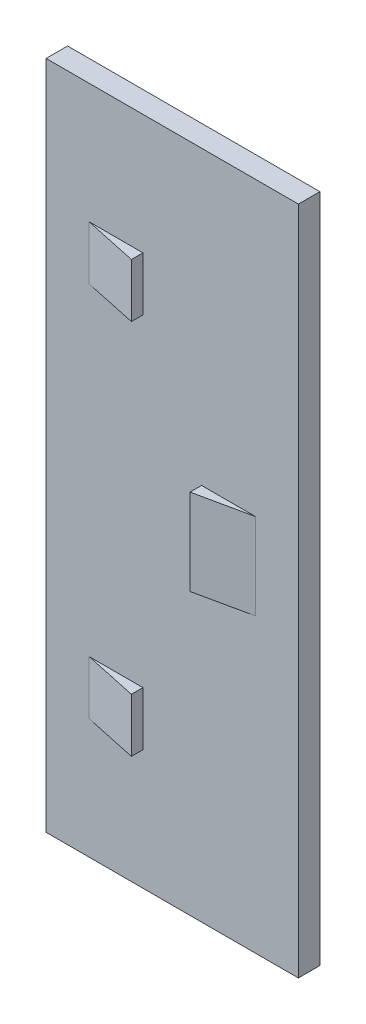
ISO-10303-21;
HEADER;
FILE_DESCRIPTION(('STEP AP214'),'2;1');
FILE_NAME('part.step','',(''),(''),'','','');
FILE_SCHEMA(('AUTOMOTIVE_DESIGN { 1 0 10303 214 1 1 1 1 }'));
ENDSEC;
DATA;
#1=APPLICATION_CONTEXT('core data for automotive mechanical design processes');
#2=APPLICATION_PROTOCOL_DEFINITION('international standard','automotive_design',2000,#1);
#3=PRODUCT_CONTEXT('',#1,'mechanical');
#4=PRODUCT('Part','Part','',(#3));
#5=PRODUCT_RELATED_PRODUCT_CATEGORY('part','',(#4));
#6=PRODUCT_DEFINITION_FORMATION('','',#4);
#7=PRODUCT_DEFINITION_CONTEXT('part definition',#1,'design');
#8=PRODUCT_DEFINITION('design','',#6,#7);
#9=PRODUCT_DEFINITION_SHAPE('','',#8);
#10=(LENGTH_UNIT() NAMED_UNIT(*) SI_UNIT(.MILLI.,.METRE.));
#11=(NAMED_UNIT(*) PLANE_ANGLE_UNIT() SI_UNIT($,.RADIAN.));
#12=(NAMED_UNIT(*) SI_UNIT($,.STERADIAN.) SOLID_ANGLE_UNIT());
#13=UNCERTAINTY_MEASURE_WITH_UNIT(LENGTH_MEASURE(1.E-05),#10,'distance_accuracy_value','');
#14=(GEOMETRIC_REPRESENTATION_CONTEXT(3) GLOBAL_UNCERTAINTY_ASSIGNED_CONTEXT((#13)) GLOBAL_UNIT_ASSIGNED_CONTEXT((#10,
#11,#12)) REPRESENTATION_CONTEXT('',''));
#15=CARTESIAN_POINT('',(0.,0.,0.));
#16=DIRECTION('',(0.,0.,1.));
#17=DIRECTION('',(1.,0.,0.));
#18=AXIS2_PLACEMENT_3D('',#15,#16,#17);
#19=CARTESIAN_POINT('',(0.,0.,2.));
#20=DIRECTION('',(0.,0.,-1.));
#21=DIRECTION('',(-1.,0.,0.));
#22=AXIS2_PLACEMENT_3D('',#19,#20,#21);
#23=PLANE('',#22);
#24=DIRECTION('',(0.,1.,0.));
#25=VECTOR('',#24,1.);
#26=CARTESIAN_POINT('',(-3.72001007722612,-1536.80950355037,2.));
#27=LINE('',#26,#25);
#28=CARTESIAN_POINT('',(-3.72001007722612,-1536.80950355037,2.));
#29=VERTEX_POINT('',#28);
#30=CARTESIAN_POINT('',(-3.72001007722612,-1528.80950355037,2.));
#31=VERTEX_POINT('',#30);
#32=EDGE_CURVE('E159',#29,#31,#27,.T.);
#33=ORIENTED_EDGE('',*,*,#32,.F.);
#34=DIRECTION('',(1.,0.,0.));
#35=VECTOR('',#34,1.);
#36=CARTESIAN_POINT('',(-3.72001007722612,-1536.80950355037,2.));
#37=LINE('',#36,#35);
#38=CARTESIAN_POINT('',(-8.72001007722612,-1536.80950355037,2.));
#39=VERTEX_POINT('',#38);
#40=EDGE_CURVE('E168',#39,#29,#37,.T.);
#41=ORIENTED_EDGE('',*,*,#40,.F.);
#42=DIRECTION('',(0.,-1.,0.));
#43=VECTOR('',#42,1.);
#44=CARTESIAN_POINT('',(-8.72001007722612,-1536.80950355037,2.));
#45=LINE('',#44,#43);
#46=CARTESIAN_POINT('',(-8.72001007722612,-1528.80950355037,2.));
#47=VERTEX_POINT('',#46);
#48=EDGE_CURVE('E165',#47,#39,#45,.T.);
#49=ORIENTED_EDGE('',*,*,#48,.F.);
#50=DIRECTION('',(-1.,0.,0.));
#51=VECTOR('',#50,1.);
#52=CARTESIAN_POINT('',(-3.72001007722612,-1528.80950355037,2.));
#53=LINE('',#52,#51);
#54=EDGE_CURVE('E162',#31,#47,#53,.T.);
#55=ORIENTED_EDGE('',*,*,#54,.F.);
#56=EDGE_LOOP('',(#33,#41,#49,#55));
#57=FACE_BOUND('',#56,.T.);
#58=DIRECTION('',(0.,1.,0.));
#59=VECTOR('',#58,1.);
#60=CARTESIAN_POINT('',(0.279989922773868,-1501.65950355037,2.));
#61=LINE('',#60,#59);
#62=CARTESIAN_POINT('',(0.279989922773876,-1563.95950355037,2.));
#63=VERTEX_POINT('',#62);
#64=CARTESIAN_POINT('',(0.279989922773868,-1501.65950355037,2.));
#65=VERTEX_POINT('',#64);
#66=EDGE_CURVE('E191',#63,#65,#61,.T.);
#67=ORIENTED_EDGE('',*,*,#66,.T.);
#68=DIRECTION('',(-1.,0.,0.));
#69=VECTOR('',#68,1.);
#70=CARTESIAN_POINT('',(0.279989922773868,-1501.65950355037,2.));
#71=LINE('',#70,#69);
#72=CARTESIAN_POINT('',(-23.1700100772261,-1501.65950355037,2.));
#73=VERTEX_POINT('',#72);
#74=EDGE_CURVE('E194',#65,#73,#71,.T.);
#75=ORIENTED_EDGE('',*,*,#74,.T.);
#76=DIRECTION('',(0.,-1.,0.));
#77=VECTOR('',#76,1.);
#78=CARTESIAN_POINT('',(-23.1700100772261,-1501.65950355037,2.));
#79=LINE('',#78,#77);
#80=CARTESIAN_POINT('',(-23.1700100772261,-1563.95950355037,2.));
#81=VERTEX_POINT('',#80);
#82=EDGE_CURVE('E197',#73,#81,#79,.T.);
#83=ORIENTED_EDGE('',*,*,#82,.T.);
#84=DIRECTION('',(1.,0.,0.));
#85=VECTOR('',#84,1.);
#86=CARTESIAN_POINT('',(0.279989922773876,-1563.95950355037,2.));
#87=LINE('',#86,#85);
#88=EDGE_CURVE('E199',#81,#63,#87,.T.);
#89=ORIENTED_EDGE('',*,*,#88,.T.);
#90=EDGE_LOOP('',(#67,#75,#83,#89));
#91=FACE_BOUND('',#90,.T.);
#92=DIRECTION('',(0.,-1.,0.));
#93=VECTOR('',#92,1.);
#94=CARTESIAN_POINT('',(-19.1700100772261,-1552.80950355037,2.));
#95=LINE('',#94,#93);
#96=CARTESIAN_POINT('',(-19.1700100772261,-1547.80950355037,2.));
#97=VERTEX_POINT('',#96);
#98=CARTESIAN_POINT('',(-19.1700100772261,-1552.80950355037,2.));
#99=VERTEX_POINT('',#98);
#100=EDGE_CURVE('E175',#97,#99,#95,.T.);
#101=ORIENTED_EDGE('',*,*,#100,.F.);
#102=DIRECTION('',(-1.,0.,0.));
#103=VECTOR('',#102,1.);
#104=CARTESIAN_POINT('',(-19.1700100772261,-1547.80950355037,2.));
#105=LINE('',#104,#103);
#106=CARTESIAN_POINT('',(-14.1700100772261,-1547.80950355037,2.));
#107=VERTEX_POINT('',#106);
#108=EDGE_CURVE('E184',#107,#97,#105,.T.);
#109=ORIENTED_EDGE('',*,*,#108,.F.);
#110=DIRECTION('',(0.,1.,0.));
#111=VECTOR('',#110,1.);
#112=CARTESIAN_POINT('',(-14.1700100772261,-1552.80950355037,2.));
#113=LINE('',#112,#111);
#114=CARTESIAN_POINT('',(-14.1700100772261,-1552.80950355037,2.));
#115=VERTEX_POINT('',#114);
#116=EDGE_CURVE('E181',#115,#107,#113,.T.);
#117=ORIENTED_EDGE('',*,*,#116,.F.);
#118=DIRECTION('',(1.,0.,0.));
#119=VECTOR('',#118,1.);
#120=CARTESIAN_POINT('',(-19.1700100772261,-1552.80950355037,2.));
#121=LINE('',#120,#119);
#122=EDGE_CURVE('E178',#99,#115,#121,.T.);
#123=ORIENTED_EDGE('',*,*,#122,.F.);
#124=EDGE_LOOP('',(#101,#109,#117,#123));
#125=FACE_BOUND('',#124,.T.);
#126=DIRECTION('',(0.,-1.,0.));
#127=VECTOR('',#126,1.);
#128=CARTESIAN_POINT('',(-19.1700100772261,-1517.80950355037,2.));
#129=LINE('',#128,#127);
#130=CARTESIAN_POINT('',(-19.1700100772261,-1512.80950355037,2.));
#131=VERTEX_POINT('',#130);
#132=CARTESIAN_POINT('',(-19.1700100772261,-1517.80950355037,2.));
#133=VERTEX_POINT('',#132);
#134=EDGE_CURVE('E132',#131,#133,#129,.T.);
#135=ORIENTED_EDGE('',*,*,#134,.F.);
#136=DIRECTION('',(-1.,0.,0.));
#137=VECTOR('',#136,1.);
#138=CARTESIAN_POINT('',(-19.1700100772261,-1512.80950355037,2.));
#139=LINE('',#138,#137);
#140=CARTESIAN_POINT('',(-14.1700100772261,-1512.80950355037,2.));
#141=VERTEX_POINT('',#140);
#142=EDGE_CURVE('E144',#141,#131,#139,.T.);
#143=ORIENTED_EDGE('',*,*,#142,.F.);
#144=DIRECTION('',(0.,1.,0.));
#145=VECTOR('',#144,1.);
#146=CARTESIAN_POINT('',(-14.1700100772261,-1517.80950355037,2.));
#147=LINE('',#146,#145);
#148=CARTESIAN_POINT('',(-14.1700100772261,-1517.80950355037,2.));
#149=VERTEX_POINT('',#148);
#150=EDGE_CURVE('E151',#149,#141,#147,.T.);
#151=ORIENTED_EDGE('',*,*,#150,.F.);
#152=DIRECTION('',(1.,0.,0.));
#153=VECTOR('',#152,1.);
#154=CARTESIAN_POINT('',(-19.1700100772261,-1517.80950355037,2.));
#155=LINE('',#154,#153);
#156=EDGE_CURVE('E147',#133,#149,#155,.T.);
#157=ORIENTED_EDGE('',*,*,#156,.F.);
#158=EDGE_LOOP('',(#135,#143,#151,#157));
#159=FACE_BOUND('',#158,.T.);
#160=ADVANCED_FACE('F35',(#57,#91,#125,#159),#23,.F.);
#161=CARTESIAN_POINT('',(0.279989922773868,-1501.65950355037,2.));
#162=DIRECTION('',(-1.,0.,0.));
#163=DIRECTION('',(0.,-1.,0.));
#164=AXIS2_PLACEMENT_3D('',#161,#162,#163);
#165=PLANE('',#164);
#166=DIRECTION('',(0.,1.,0.));
#167=VECTOR('',#166,1.);
#168=CARTESIAN_POINT('',(0.279989922773868,-1501.65950355037,0.));
#169=LINE('',#168,#167);
#170=CARTESIAN_POINT('',(0.279989922773876,-1563.95950355037,0.));
#171=VERTEX_POINT('',#170);
#172=CARTESIAN_POINT('',(0.279989922773868,-1501.65950355037,0.));
#173=VERTEX_POINT('',#172);
#174=EDGE_CURVE('E190',#171,#173,#169,.T.);
#175=ORIENTED_EDGE('',*,*,#174,.T.);
#176=DIRECTION('',(0.,0.,-1.));
#177=VECTOR('',#176,1.);
#178=CARTESIAN_POINT('',(0.279989922773868,-1501.65950355037,2.));
#179=LINE('',#178,#177);
#180=EDGE_CURVE('E217',#65,#173,#179,.T.);
#181=ORIENTED_EDGE('',*,*,#180,.F.);
#182=ORIENTED_EDGE('',*,*,#66,.F.);
#183=DIRECTION('',(0.,0.,-1.));
#184=VECTOR('',#183,1.);
#185=CARTESIAN_POINT('',(0.279989922773876,-1563.95950355037,2.));
#186=LINE('',#185,#184);
#187=EDGE_CURVE('E201',#63,#171,#186,.T.);
#188=ORIENTED_EDGE('',*,*,#187,.T.);
#189=EDGE_LOOP('',(#175,#181,#182,#188));
#190=FACE_BOUND('',#189,.T.);
#191=ADVANCED_FACE('F243',(#190),#165,.F.);
#192=CARTESIAN_POINT('',(0.279989922773868,-1501.65950355037,2.));
#193=DIRECTION('',(0.,-1.,0.));
#194=DIRECTION('',(0.,0.,-1.));
#195=AXIS2_PLACEMENT_3D('',#192,#193,#194);
#196=PLANE('',#195);
#197=DIRECTION('',(-1.,0.,0.));
#198=VECTOR('',#197,1.);
#199=CARTESIAN_POINT('',(0.279989922773868,-1501.65950355037,0.));
#200=LINE('',#199,#198);
#201=CARTESIAN_POINT('',(-23.1700100772261,-1501.65950355037,0.));
#202=VERTEX_POINT('',#201);
#203=EDGE_CURVE('E204',#173,#202,#200,.T.);
#204=ORIENTED_EDGE('',*,*,#203,.T.);
#205=DIRECTION('',(0.,0.,-1.));
#206=VECTOR('',#205,1.);
#207=CARTESIAN_POINT('',(-23.1700100772261,-1501.65950355037,2.));
#208=LINE('',#207,#206);
#209=EDGE_CURVE('E214',#73,#202,#208,.T.);
#210=ORIENTED_EDGE('',*,*,#209,.F.);
#211=ORIENTED_EDGE('',*,*,#74,.F.);
#212=ORIENTED_EDGE('',*,*,#180,.T.);
#213=EDGE_LOOP('',(#204,#210,#211,#212));
#214=FACE_BOUND('',#213,.T.);
#215=ADVANCED_FACE('F249',(#214),#196,.F.);
#216=CARTESIAN_POINT('',(-23.1700100772261,-1501.65950355037,2.));
#217=DIRECTION('',(1.,0.,0.));
#218=DIRECTION('',(0.,1.,0.));
#219=AXIS2_PLACEMENT_3D('',#216,#217,#218);
#220=PLANE('',#219);
#221=DIRECTION('',(0.,-1.,0.));
#222=VECTOR('',#221,1.);
#223=CARTESIAN_POINT('',(-23.1700100772261,-1501.65950355037,0.));
#224=LINE('',#223,#222);
#225=CARTESIAN_POINT('',(-23.1700100772261,-1563.95950355037,0.));
#226=VERTEX_POINT('',#225);
#227=EDGE_CURVE('E206',#202,#226,#224,.T.);
#228=ORIENTED_EDGE('',*,*,#227,.T.);
#229=DIRECTION('',(0.,0.,-1.));
#230=VECTOR('',#229,1.);
#231=CARTESIAN_POINT('',(-23.1700100772261,-1563.95950355037,2.));
#232=LINE('',#231,#230);
#233=EDGE_CURVE('E211',#81,#226,#232,.T.);
#234=ORIENTED_EDGE('',*,*,#233,.F.);
#235=ORIENTED_EDGE('',*,*,#82,.F.);
#236=ORIENTED_EDGE('',*,*,#209,.T.);
#237=EDGE_LOOP('',(#228,#234,#235,#236));
#238=FACE_BOUND('',#237,.T.);
#239=ADVANCED_FACE('F264',(#238),#220,.F.);
#240=CARTESIAN_POINT('',(0.279989922773876,-1563.95950355037,2.));
#241=DIRECTION('',(0.,1.,0.));
#242=DIRECTION('',(0.,0.,1.));
#243=AXIS2_PLACEMENT_3D('',#240,#241,#242);
#244=PLANE('',#243);
#245=DIRECTION('',(1.,0.,0.));
#246=VECTOR('',#245,1.);
#247=CARTESIAN_POINT('',(0.279989922773876,-1563.95950355037,0.));
#248=LINE('',#247,#246);
#249=EDGE_CURVE('E195',#226,#171,#248,.T.);
#250=ORIENTED_EDGE('',*,*,#249,.T.);
#251=ORIENTED_EDGE('',*,*,#187,.F.);
#252=ORIENTED_EDGE('',*,*,#88,.F.);
#253=ORIENTED_EDGE('',*,*,#233,.T.);
#254=EDGE_LOOP('',(#250,#251,#252,#253));
#255=FACE_BOUND('',#254,.T.);
#256=ADVANCED_FACE('F260',(#255),#244,.F.);
#257=CARTESIAN_POINT('',(0.,0.,0.));
#258=DIRECTION('',(0.,0.,-1.));
#259=DIRECTION('',(-1.,0.,0.));
#260=AXIS2_PLACEMENT_3D('',#257,#258,#259);
#261=PLANE('',#260);
#262=ORIENTED_EDGE('',*,*,#174,.F.);
#263=ORIENTED_EDGE('',*,*,#249,.F.);
#264=ORIENTED_EDGE('',*,*,#227,.F.);
#265=ORIENTED_EDGE('',*,*,#203,.F.);
#266=EDGE_LOOP('',(#262,#263,#264,#265));
#267=FACE_BOUND('',#266,.T.);
#268=ADVANCED_FACE('F257',(#267),#261,.T.);
#269=CARTESIAN_POINT('',(-19.1700100772261,-1552.80950355037,3.5));
#270=DIRECTION('',(0.,1.,0.));
#271=DIRECTION('',(0.,0.,1.));
#272=AXIS2_PLACEMENT_3D('',#269,#270,#271);
#273=PLANE('',#272);
#274=DIRECTION('',(0.,0.,-1.));
#275=VECTOR('',#274,1.);
#276=CARTESIAN_POINT('',(-14.1700100772261,-1552.80950355037,3.5));
#277=LINE('',#276,#275);
#278=CARTESIAN_POINT('',(-14.1700100772261,-1552.80950355037,3.07142857142857));
#279=VERTEX_POINT('',#278);
#280=EDGE_CURVE('E188',#279,#115,#277,.T.);
#281=ORIENTED_EDGE('',*,*,#280,.F.);
#282=DIRECTION('',(0.97780241407741,0.,0.209529088730874));
#283=VECTOR('',#282,1.);
#284=CARTESIAN_POINT('',(-12.1700100772261,-1552.80950355037,3.5));
#285=LINE('',#284,#283);
#286=EDGE_CURVE('E43',#279,#99,#285,.F.);
#287=ORIENTED_EDGE('',*,*,#286,.T.);
#288=ORIENTED_EDGE('',*,*,#122,.T.);
#289=EDGE_LOOP('',(#281,#287,#288));
#290=FACE_BOUND('',#289,.T.);
#291=ADVANCED_FACE('F230',(#290),#273,.F.);
#292=CARTESIAN_POINT('',(-14.1700100772261,-1552.80950355037,3.5));
#293=DIRECTION('',(-1.,0.,0.));
#294=DIRECTION('',(0.,0.,1.));
#295=AXIS2_PLACEMENT_3D('',#292,#293,#294);
#296=PLANE('',#295);
#297=DIRECTION('',(0.,0.,-1.));
#298=VECTOR('',#297,1.);
#299=CARTESIAN_POINT('',(-14.1700100772261,-1547.80950355037,3.5));
#300=LINE('',#299,#298);
#301=CARTESIAN_POINT('',(-14.1700100772261,-1547.80950355037,3.07142857142857));
#302=VERTEX_POINT('',#301);
#303=EDGE_CURVE('E186',#302,#107,#300,.T.);
#304=ORIENTED_EDGE('',*,*,#303,.F.);
#305=DIRECTION('',(0.,1.,0.));
#306=VECTOR('',#305,1.);
#307=CARTESIAN_POINT('',(-14.1700100772261,0.,3.07142857142857));
#308=LINE('',#307,#306);
#309=EDGE_CURVE('E50',#302,#279,#308,.F.);
#310=ORIENTED_EDGE('',*,*,#309,.T.);
#311=ORIENTED_EDGE('',*,*,#280,.T.);
#312=ORIENTED_EDGE('',*,*,#116,.T.);
#313=EDGE_LOOP('',(#304,#310,#311,#312));
#314=FACE_BOUND('',#313,.T.);
#315=ADVANCED_FACE('F302',(#314),#296,.F.);
#316=CARTESIAN_POINT('',(-19.1700100772261,-1547.80950355037,3.5));
#317=DIRECTION('',(0.,-1.,0.));
#318=DIRECTION('',(0.,0.,-1.));
#319=AXIS2_PLACEMENT_3D('',#316,#317,#318);
#320=PLANE('',#319);
#321=ORIENTED_EDGE('',*,*,#108,.T.);
#322=DIRECTION('',(-0.97780241407741,0.,-0.209529088730874));
#323=VECTOR('',#322,1.);
#324=CARTESIAN_POINT('',(-12.1700100772261,-1547.80950355037,3.5));
#325=LINE('',#324,#323);
#326=EDGE_CURVE('E11',#97,#302,#325,.F.);
#327=ORIENTED_EDGE('',*,*,#326,.T.);
#328=ORIENTED_EDGE('',*,*,#303,.T.);
#329=EDGE_LOOP('',(#321,#327,#328));
#330=FACE_BOUND('',#329,.T.);
#331=ADVANCED_FACE('F299',(#330),#320,.F.);
#332=CARTESIAN_POINT('',(-3.72001007722612,-1528.80950355037,3.5));
#333=DIRECTION('',(0.,-1.,0.));
#334=DIRECTION('',(0.,0.,-1.));
#335=AXIS2_PLACEMENT_3D('',#332,#333,#334);
#336=PLANE('',#335);
#337=DIRECTION('',(0.,0.,-1.));
#338=VECTOR('',#337,1.);
#339=CARTESIAN_POINT('',(-8.72001007722612,-1528.80950355037,3.5));
#340=LINE('',#339,#338);
#341=CARTESIAN_POINT('',(-8.72001007722612,-1528.80950355037,3.07142857142857));
#342=VERTEX_POINT('',#341);
#343=EDGE_CURVE('E173',#342,#47,#340,.T.);
#344=ORIENTED_EDGE('',*,*,#343,.F.);
#345=DIRECTION('',(0.97780241407741,0.,-0.209529088730874));
#346=VECTOR('',#345,1.);
#347=CARTESIAN_POINT('',(-10.7200100772261,-1528.80950355037,3.5));
#348=LINE('',#347,#346);
#349=EDGE_CURVE('E223',#342,#31,#348,.T.);
#350=ORIENTED_EDGE('',*,*,#349,.T.);
#351=ORIENTED_EDGE('',*,*,#54,.T.);
#352=EDGE_LOOP('',(#344,#350,#351));
#353=FACE_BOUND('',#352,.T.);
#354=ADVANCED_FACE('F295',(#353),#336,.F.);
#355=CARTESIAN_POINT('',(-8.72001007722612,-1536.80950355037,3.5));
#356=DIRECTION('',(1.,0.,0.));
#357=DIRECTION('',(0.,0.,-1.));
#358=AXIS2_PLACEMENT_3D('',#355,#356,#357);
#359=PLANE('',#358);
#360=DIRECTION('',(0.,0.,-1.));
#361=VECTOR('',#360,1.);
#362=CARTESIAN_POINT('',(-8.72001007722612,-1536.80950355037,3.5));
#363=LINE('',#362,#361);
#364=CARTESIAN_POINT('',(-8.72001007722612,-1536.80950355037,3.07142857142857));
#365=VERTEX_POINT('',#364);
#366=EDGE_CURVE('E171',#365,#39,#363,.T.);
#367=ORIENTED_EDGE('',*,*,#366,.F.);
#368=DIRECTION('',(0.,1.,0.));
#369=VECTOR('',#368,1.);
#370=CARTESIAN_POINT('',(-8.72001007722612,0.,3.07142857142857));
#371=LINE('',#370,#369);
#372=EDGE_CURVE('E137',#365,#342,#371,.T.);
#373=ORIENTED_EDGE('',*,*,#372,.T.);
#374=ORIENTED_EDGE('',*,*,#343,.T.);
#375=ORIENTED_EDGE('',*,*,#48,.T.);
#376=EDGE_LOOP('',(#367,#373,#374,#375));
#377=FACE_BOUND('',#376,.T.);
#378=ADVANCED_FACE('F291',(#377),#359,.F.);
#379=CARTESIAN_POINT('',(-3.72001007722612,-1536.80950355037,3.5));
#380=DIRECTION('',(0.,1.,0.));
#381=DIRECTION('',(0.,0.,1.));
#382=AXIS2_PLACEMENT_3D('',#379,#380,#381);
#383=PLANE('',#382);
#384=ORIENTED_EDGE('',*,*,#40,.T.);
#385=DIRECTION('',(-0.97780241407741,0.,0.209529088730874));
#386=VECTOR('',#385,1.);
#387=CARTESIAN_POINT('',(-10.7200100772261,-1536.80950355037,3.5));
#388=LINE('',#387,#386);
#389=EDGE_CURVE('E225',#29,#365,#388,.T.);
#390=ORIENTED_EDGE('',*,*,#389,.T.);
#391=ORIENTED_EDGE('',*,*,#366,.T.);
#392=EDGE_LOOP('',(#384,#390,#391));
#393=FACE_BOUND('',#392,.T.);
#394=ADVANCED_FACE('F287',(#393),#383,.F.);
#395=CARTESIAN_POINT('',(-19.1700100772261,-1517.80950355037,3.5));
#396=DIRECTION('',(0.,1.,0.));
#397=DIRECTION('',(0.,0.,1.));
#398=AXIS2_PLACEMENT_3D('',#395,#396,#397);
#399=PLANE('',#398);
#400=DIRECTION('',(0.,0.,-1.));
#401=VECTOR('',#400,1.);
#402=CARTESIAN_POINT('',(-14.1700100772261,-1517.80950355037,3.5));
#403=LINE('',#402,#401);
#404=CARTESIAN_POINT('',(-14.1700100772261,-1517.80950355037,3.07142857142857));
#405=VERTEX_POINT('',#404);
#406=EDGE_CURVE('E153',#405,#149,#403,.T.);
#407=ORIENTED_EDGE('',*,*,#406,.F.);
#408=DIRECTION('',(0.97780241407741,0.,0.209529088730874));
#409=VECTOR('',#408,1.);
#410=CARTESIAN_POINT('',(-12.1700100772261,-1517.80950355037,3.5));
#411=LINE('',#410,#409);
#412=EDGE_CURVE('E138',#405,#133,#411,.F.);
#413=ORIENTED_EDGE('',*,*,#412,.T.);
#414=ORIENTED_EDGE('',*,*,#156,.T.);
#415=EDGE_LOOP('',(#407,#413,#414));
#416=FACE_BOUND('',#415,.T.);
#417=ADVANCED_FACE('F281',(#416),#399,.F.);
#418=CARTESIAN_POINT('',(-14.1700100772261,-1517.80950355037,3.5));
#419=DIRECTION('',(-1.,0.,0.));
#420=DIRECTION('',(0.,0.,1.));
#421=AXIS2_PLACEMENT_3D('',#418,#419,#420);
#422=PLANE('',#421);
#423=DIRECTION('',(0.,0.,-1.));
#424=VECTOR('',#423,1.);
#425=CARTESIAN_POINT('',(-14.1700100772261,-1512.80950355037,3.5));
#426=LINE('',#425,#424);
#427=CARTESIAN_POINT('',(-14.1700100772261,-1512.80950355037,3.07142857142857));
#428=VERTEX_POINT('',#427);
#429=EDGE_CURVE('E150',#428,#141,#426,.T.);
#430=ORIENTED_EDGE('',*,*,#429,.F.);
#431=DIRECTION('',(0.,1.,0.));
#432=VECTOR('',#431,1.);
#433=CARTESIAN_POINT('',(-14.1700100772261,0.,3.07142857142857));
#434=LINE('',#433,#432);
#435=EDGE_CURVE('E133',#428,#405,#434,.F.);
#436=ORIENTED_EDGE('',*,*,#435,.T.);
#437=ORIENTED_EDGE('',*,*,#406,.T.);
#438=ORIENTED_EDGE('',*,*,#150,.T.);
#439=EDGE_LOOP('',(#430,#436,#437,#438));
#440=FACE_BOUND('',#439,.T.);
#441=ADVANCED_FACE('F276',(#440),#422,.F.);
#442=CARTESIAN_POINT('',(-19.1700100772261,-1512.80950355037,3.5));
#443=DIRECTION('',(0.,-1.,0.));
#444=DIRECTION('',(0.,0.,-1.));
#445=AXIS2_PLACEMENT_3D('',#442,#443,#444);
#446=PLANE('',#445);
#447=ORIENTED_EDGE('',*,*,#142,.T.);
#448=DIRECTION('',(-0.97780241407741,0.,-0.209529088730874));
#449=VECTOR('',#448,1.);
#450=CARTESIAN_POINT('',(-12.1700100772261,-1512.80950355037,3.5));
#451=LINE('',#450,#449);
#452=EDGE_CURVE('E128',#131,#428,#451,.F.);
#453=ORIENTED_EDGE('',*,*,#452,.T.);
#454=ORIENTED_EDGE('',*,*,#429,.T.);
#455=EDGE_LOOP('',(#447,#453,#454));
#456=FACE_BOUND('',#455,.T.);
#457=ADVANCED_FACE('F149',(#456),#446,.F.);
#458=CARTESIAN_POINT('',(-12.1700100772261,0.,3.5));
#459=DIRECTION('',(0.209529088730873,0.,-0.977802414077409));
#460=DIRECTION('',(0.,-1.,0.));
#461=AXIS2_PLACEMENT_3D('',#458,#459,#460);
#462=PLANE('',#461);
#463=ORIENTED_EDGE('',*,*,#452,.F.);
#464=ORIENTED_EDGE('',*,*,#134,.T.);
#465=ORIENTED_EDGE('',*,*,#412,.F.);
#466=ORIENTED_EDGE('',*,*,#435,.F.);
#467=EDGE_LOOP('',(#463,#464,#465,#466));
#468=FACE_BOUND('',#467,.T.);
#469=ADVANCED_FACE('F130',(#468),#462,.F.);
#470=CARTESIAN_POINT('',(-10.7200100772261,0.,3.5));
#471=DIRECTION('',(0.209529088730873,0.,0.977802414077409));
#472=DIRECTION('',(0.,-1.,0.));
#473=AXIS2_PLACEMENT_3D('',#470,#471,#472);
#474=PLANE('',#473);
#475=ORIENTED_EDGE('',*,*,#389,.F.);
#476=ORIENTED_EDGE('',*,*,#32,.T.);
#477=ORIENTED_EDGE('',*,*,#349,.F.);
#478=ORIENTED_EDGE('',*,*,#372,.F.);
#479=EDGE_LOOP('',(#475,#476,#477,#478));
#480=FACE_BOUND('',#479,.T.);
#481=ADVANCED_FACE('F237',(#480),#474,.T.);
#482=CARTESIAN_POINT('',(-12.1700100772261,0.,3.5));
#483=DIRECTION('',(0.209529088730873,0.,-0.977802414077409));
#484=DIRECTION('',(0.,-1.,0.));
#485=AXIS2_PLACEMENT_3D('',#482,#483,#484);
#486=PLANE('',#485);
#487=ORIENTED_EDGE('',*,*,#326,.F.);
#488=ORIENTED_EDGE('',*,*,#100,.T.);
#489=ORIENTED_EDGE('',*,*,#286,.F.);
#490=ORIENTED_EDGE('',*,*,#309,.F.);
#491=EDGE_LOOP('',(#487,#488,#489,#490));
#492=FACE_BOUND('',#491,.T.);
#493=ADVANCED_FACE('F37',(#492),#486,.F.);
#494=CLOSED_SHELL('',(#160,#191,#215,#239,#256,#268,#291,#315,#331,#354,#378,#394,#417,#441,
#457,#469,#481,#493));
#495=MANIFOLD_SOLID_BREP('B2',#494);
#496=ADVANCED_BREP_SHAPE_REPRESENTATION('',(#18,#495),#14);
#497=SHAPE_DEFINITION_REPRESENTATION(#9,#496);
ENDSEC;
END-ISO-10303-21;
